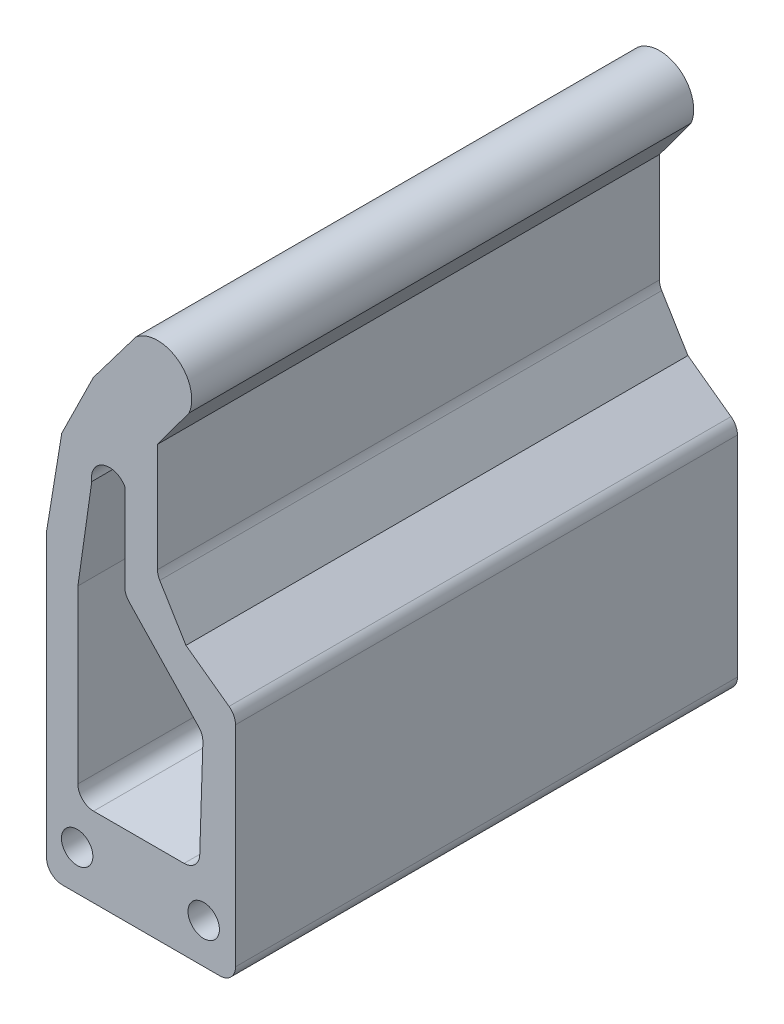
ISO-10303-21;
HEADER;
FILE_DESCRIPTION(('STEP AP214'),'2;1');
FILE_NAME('part.step','',(''),(''),'','','');
FILE_SCHEMA(('AUTOMOTIVE_DESIGN { 1 0 10303 214 1 1 1 1 }'));
ENDSEC;
DATA;
#1=APPLICATION_CONTEXT('core data for automotive mechanical design processes');
#2=APPLICATION_PROTOCOL_DEFINITION('international standard','automotive_design',2000,#1);
#3=PRODUCT_CONTEXT('',#1,'mechanical');
#4=PRODUCT('Part','Part','',(#3));
#5=PRODUCT_RELATED_PRODUCT_CATEGORY('part','',(#4));
#6=PRODUCT_DEFINITION_FORMATION('','',#4);
#7=PRODUCT_DEFINITION_CONTEXT('part definition',#1,'design');
#8=PRODUCT_DEFINITION('design','',#6,#7);
#9=PRODUCT_DEFINITION_SHAPE('','',#8);
#10=(LENGTH_UNIT() NAMED_UNIT(*) SI_UNIT(.MILLI.,.METRE.));
#11=(NAMED_UNIT(*) PLANE_ANGLE_UNIT() SI_UNIT($,.RADIAN.));
#12=(NAMED_UNIT(*) SI_UNIT($,.STERADIAN.) SOLID_ANGLE_UNIT());
#13=UNCERTAINTY_MEASURE_WITH_UNIT(LENGTH_MEASURE(1.E-05),#10,'distance_accuracy_value','');
#14=(GEOMETRIC_REPRESENTATION_CONTEXT(3) GLOBAL_UNCERTAINTY_ASSIGNED_CONTEXT((#13)) GLOBAL_UNIT_ASSIGNED_CONTEXT((#10,
#11,#12)) REPRESENTATION_CONTEXT('',''));
#15=CARTESIAN_POINT('',(0.,0.,0.));
#16=DIRECTION('',(0.,0.,1.));
#17=DIRECTION('',(1.,0.,0.));
#18=AXIS2_PLACEMENT_3D('',#15,#16,#17);
#19=CARTESIAN_POINT('',(-300.,367.,72.));
#20=DIRECTION('',(0.986834646515188,-0.161732434710062,0.));
#21=DIRECTION('',(0.161732434710062,0.986834646515188,0.));
#22=AXIS2_PLACEMENT_3D('',#19,#20,#21);
#23=PLANE('',#22);
#24=DIRECTION('',(-0.161732434710062,-0.986834646515188,0.));
#25=VECTOR('',#24,1.);
#26=CARTESIAN_POINT('',(-300.,367.,40.));
#27=LINE('',#26,#25);
#28=CARTESIAN_POINT('',(-299.02960539174,372.921007879091,40.));
#29=VERTEX_POINT('',#28);
#30=CARTESIAN_POINT('',(-300.,367.,40.));
#31=VERTEX_POINT('',#30);
#32=EDGE_CURVE('E292',#29,#31,#27,.T.);
#33=ORIENTED_EDGE('',*,*,#32,.T.);
#34=DIRECTION('',(0.,0.,-1.));
#35=VECTOR('',#34,1.);
#36=CARTESIAN_POINT('',(-300.,367.,72.));
#37=LINE('',#36,#35);
#38=CARTESIAN_POINT('',(-300.,367.,72.));
#39=VERTEX_POINT('',#38);
#40=EDGE_CURVE('E391',#39,#31,#37,.T.);
#41=ORIENTED_EDGE('',*,*,#40,.F.);
#42=DIRECTION('',(-0.161732434710062,-0.986834646515188,0.));
#43=VECTOR('',#42,1.);
#44=CARTESIAN_POINT('',(-300.,367.,72.));
#45=LINE('',#44,#43);
#46=CARTESIAN_POINT('',(-299.02960539174,372.921007879091,72.));
#47=VERTEX_POINT('',#46);
#48=EDGE_CURVE('E295',#47,#39,#45,.T.);
#49=ORIENTED_EDGE('',*,*,#48,.F.);
#50=DIRECTION('',(0.,0.,-1.));
#51=VECTOR('',#50,1.);
#52=CARTESIAN_POINT('',(-299.02960539174,372.921007879091,72.));
#53=LINE('',#52,#51);
#54=EDGE_CURVE('E332',#47,#29,#53,.T.);
#55=ORIENTED_EDGE('',*,*,#54,.T.);
#56=EDGE_LOOP('',(#33,#41,#49,#55));
#57=FACE_BOUND('',#56,.T.);
#58=ADVANCED_FACE('F39',(#57),#23,.F.);
#59=CARTESIAN_POINT('',(-300.,367.,72.));
#60=DIRECTION('',(1.,0.,0.));
#61=DIRECTION('',(0.,0.,-1.));
#62=AXIS2_PLACEMENT_3D('',#59,#60,#61);
#63=PLANE('',#62);
#64=DIRECTION('',(0.,-1.,0.));
#65=VECTOR('',#64,1.);
#66=CARTESIAN_POINT('',(-300.,367.,40.));
#67=LINE('',#66,#65);
#68=CARTESIAN_POINT('',(-300.,349.,40.));
#69=VERTEX_POINT('',#68);
#70=EDGE_CURVE('E336',#31,#69,#67,.T.);
#71=ORIENTED_EDGE('',*,*,#70,.T.);
#72=DIRECTION('',(0.,0.,-1.));
#73=VECTOR('',#72,1.);
#74=CARTESIAN_POINT('',(-300.,349.,72.));
#75=LINE('',#74,#73);
#76=CARTESIAN_POINT('',(-300.,349.,72.));
#77=VERTEX_POINT('',#76);
#78=EDGE_CURVE('E442',#69,#77,#75,.F.);
#79=ORIENTED_EDGE('',*,*,#78,.T.);
#80=DIRECTION('',(0.,-1.,0.));
#81=VECTOR('',#80,1.);
#82=CARTESIAN_POINT('',(-300.,367.,72.));
#83=LINE('',#82,#81);
#84=EDGE_CURVE('E299',#39,#77,#83,.T.);
#85=ORIENTED_EDGE('',*,*,#84,.F.);
#86=ORIENTED_EDGE('',*,*,#40,.T.);
#87=EDGE_LOOP('',(#71,#79,#85,#86));
#88=FACE_BOUND('',#87,.T.);
#89=ADVANCED_FACE('F540',(#88),#63,.F.);
#90=CARTESIAN_POINT('',(-300.,348.,72.));
#91=DIRECTION('',(0.,1.,0.));
#92=DIRECTION('',(0.,0.,1.));
#93=AXIS2_PLACEMENT_3D('',#90,#91,#92);
#94=PLANE('',#93);
#95=DIRECTION('',(1.,0.,0.));
#96=VECTOR('',#95,1.);
#97=CARTESIAN_POINT('',(-300.,348.,40.));
#98=LINE('',#97,#96);
#99=CARTESIAN_POINT('',(-299.,348.,40.));
#100=VERTEX_POINT('',#99);
#101=CARTESIAN_POINT('',(-288.951606439745,348.,40.));
#102=VERTEX_POINT('',#101);
#103=EDGE_CURVE('E340',#100,#102,#98,.T.);
#104=ORIENTED_EDGE('',*,*,#103,.T.);
#105=DIRECTION('',(0.,0.,-1.));
#106=VECTOR('',#105,1.);
#107=CARTESIAN_POINT('',(-288.951606439745,348.,72.));
#108=LINE('',#107,#106);
#109=CARTESIAN_POINT('',(-288.951606439745,348.,72.));
#110=VERTEX_POINT('',#109);
#111=EDGE_CURVE('E55',#102,#110,#108,.F.);
#112=ORIENTED_EDGE('',*,*,#111,.T.);
#113=DIRECTION('',(1.,0.,0.));
#114=VECTOR('',#113,1.);
#115=CARTESIAN_POINT('',(-300.,348.,72.));
#116=LINE('',#115,#114);
#117=CARTESIAN_POINT('',(-299.,348.,72.));
#118=VERTEX_POINT('',#117);
#119=EDGE_CURVE('E303',#118,#110,#116,.T.);
#120=ORIENTED_EDGE('',*,*,#119,.F.);
#121=DIRECTION('',(0.,0.,-1.));
#122=VECTOR('',#121,1.);
#123=CARTESIAN_POINT('',(-299.,348.,72.));
#124=LINE('',#123,#122);
#125=EDGE_CURVE('E436',#118,#100,#124,.T.);
#126=ORIENTED_EDGE('',*,*,#125,.T.);
#127=EDGE_LOOP('',(#104,#112,#120,#126));
#128=FACE_BOUND('',#127,.T.);
#129=ADVANCED_FACE('F546',(#128),#94,.F.);
#130=CARTESIAN_POINT('',(-287.951606439745,348.,72.));
#131=DIRECTION('',(-1.,0.,0.));
#132=DIRECTION('',(0.,0.,1.));
#133=AXIS2_PLACEMENT_3D('',#130,#131,#132);
#134=PLANE('',#133);
#135=DIRECTION('',(0.,1.,0.));
#136=VECTOR('',#135,1.);
#137=CARTESIAN_POINT('',(-287.951606439745,348.,40.));
#138=LINE('',#137,#136);
#139=CARTESIAN_POINT('',(-287.951606439745,349.,40.));
#140=VERTEX_POINT('',#139);
#141=CARTESIAN_POINT('',(-287.951606439745,362.362205386471,40.));
#142=VERTEX_POINT('',#141);
#143=EDGE_CURVE('E343',#140,#142,#138,.T.);
#144=ORIENTED_EDGE('',*,*,#143,.T.);
#145=DIRECTION('',(0.,0.,-1.));
#146=VECTOR('',#145,1.);
#147=CARTESIAN_POINT('',(-287.951606439745,362.362205386471,72.));
#148=LINE('',#147,#146);
#149=CARTESIAN_POINT('',(-287.951606439745,362.362205386471,72.));
#150=VERTEX_POINT('',#149);
#151=EDGE_CURVE('E422',#142,#150,#148,.F.);
#152=ORIENTED_EDGE('',*,*,#151,.T.);
#153=DIRECTION('',(0.,1.,0.));
#154=VECTOR('',#153,1.);
#155=CARTESIAN_POINT('',(-287.951606439745,348.,72.));
#156=LINE('',#155,#154);
#157=CARTESIAN_POINT('',(-287.951606439745,349.,72.));
#158=VERTEX_POINT('',#157);
#159=EDGE_CURVE('E306',#158,#150,#156,.T.);
#160=ORIENTED_EDGE('',*,*,#159,.F.);
#161=DIRECTION('',(0.,0.,-1.));
#162=VECTOR('',#161,1.);
#163=CARTESIAN_POINT('',(-287.951606439745,349.,72.));
#164=LINE('',#163,#162);
#165=EDGE_CURVE('E418',#158,#140,#164,.T.);
#166=ORIENTED_EDGE('',*,*,#165,.T.);
#167=EDGE_LOOP('',(#144,#152,#160,#166));
#168=FACE_BOUND('',#167,.T.);
#169=ADVANCED_FACE('F710',(#168),#134,.F.);
#170=CARTESIAN_POINT('',(-287.951606439745,362.871836257271,72.));
#171=DIRECTION('',(-0.587649831397212,-0.809115366099809,0.));
#172=DIRECTION('',(0.809115366099809,-0.587649831397212,0.));
#173=AXIS2_PLACEMENT_3D('',#170,#171,#172);
#174=PLANE('',#173);
#175=DIRECTION('',(-0.809115366099809,0.587649831397212,0.));
#176=VECTOR('',#175,1.);
#177=CARTESIAN_POINT('',(-287.951606439745,362.871836257271,72.));
#178=LINE('',#177,#176);
#179=CARTESIAN_POINT('',(-288.363956608348,363.171320752571,72.));
#180=VERTEX_POINT('',#179);
#181=CARTESIAN_POINT('',(-291.110931396484,365.166412353516,72.));
#182=VERTEX_POINT('',#181);
#183=EDGE_CURVE('E310',#180,#182,#178,.T.);
#184=ORIENTED_EDGE('',*,*,#183,.F.);
#185=DIRECTION('',(0.,0.,-1.));
#186=VECTOR('',#185,1.);
#187=CARTESIAN_POINT('',(-288.363956608348,363.171320752571,72.));
#188=LINE('',#187,#186);
#189=CARTESIAN_POINT('',(-288.363956608348,363.171320752571,40.));
#190=VERTEX_POINT('',#189);
#191=EDGE_CURVE('E402',#180,#190,#188,.T.);
#192=ORIENTED_EDGE('',*,*,#191,.T.);
#193=DIRECTION('',(-0.809115366099809,0.587649831397212,0.));
#194=VECTOR('',#193,1.);
#195=CARTESIAN_POINT('',(-287.951606439745,362.871836257271,40.));
#196=LINE('',#195,#194);
#197=CARTESIAN_POINT('',(-291.110931396484,365.166412353516,40.));
#198=VERTEX_POINT('',#197);
#199=EDGE_CURVE('E347',#190,#198,#196,.T.);
#200=ORIENTED_EDGE('',*,*,#199,.T.);
#201=DIRECTION('',(0.,0.,-1.));
#202=VECTOR('',#201,1.);
#203=CARTESIAN_POINT('',(-291.110931396484,365.166412353516,72.));
#204=LINE('',#203,#202);
#205=EDGE_CURVE('E387',#182,#198,#204,.T.);
#206=ORIENTED_EDGE('',*,*,#205,.F.);
#207=EDGE_LOOP('',(#184,#192,#200,#206));
#208=FACE_BOUND('',#207,.T.);
#209=ADVANCED_FACE('F700',(#208),#174,.F.);
#210=CARTESIAN_POINT('',(-291.110931396484,365.166412353516,72.));
#211=DIRECTION('',(-0.855055239305162,-0.518536920321776,0.));
#212=DIRECTION('',(0.518536920321776,-0.855055239305162,0.));
#213=AXIS2_PLACEMENT_3D('',#210,#211,#212);
#214=PLANE('',#213);
#215=DIRECTION('',(-0.518536920321776,0.855055239305162,0.));
#216=VECTOR('',#215,1.);
#217=CARTESIAN_POINT('',(-291.110931396484,365.166412353516,40.));
#218=LINE('',#217,#216);
#219=CARTESIAN_POINT('',(-292.780865856916,367.920095174793,40.));
#220=VERTEX_POINT('',#219);
#221=EDGE_CURVE('E350',#198,#220,#218,.T.);
#222=ORIENTED_EDGE('',*,*,#221,.T.);
#223=DIRECTION('',(0.,0.,-1.));
#224=VECTOR('',#223,1.);
#225=CARTESIAN_POINT('',(-292.780865856916,367.920095174793,72.));
#226=LINE('',#225,#224);
#227=CARTESIAN_POINT('',(-292.780865856916,367.920095174793,72.));
#228=VERTEX_POINT('',#227);
#229=EDGE_CURVE('E399',#220,#228,#226,.F.);
#230=ORIENTED_EDGE('',*,*,#229,.T.);
#231=DIRECTION('',(-0.518536920321776,0.855055239305162,0.));
#232=VECTOR('',#231,1.);
#233=CARTESIAN_POINT('',(-291.110931396484,365.166412353516,72.));
#234=LINE('',#233,#232);
#235=EDGE_CURVE('E313',#182,#228,#234,.T.);
#236=ORIENTED_EDGE('',*,*,#235,.F.);
#237=ORIENTED_EDGE('',*,*,#205,.T.);
#238=EDGE_LOOP('',(#222,#230,#236,#237));
#239=FACE_BOUND('',#238,.T.);
#240=ADVANCED_FACE('F688',(#239),#214,.F.);
#241=CARTESIAN_POINT('',(-292.925810617611,368.159105691084,72.));
#242=DIRECTION('',(-1.,0.,0.));
#243=DIRECTION('',(0.,0.,1.));
#244=AXIS2_PLACEMENT_3D('',#241,#242,#243);
#245=PLANE('',#244);
#246=DIRECTION('',(0.,1.,0.));
#247=VECTOR('',#246,1.);
#248=CARTESIAN_POINT('',(-292.925810617611,368.159105691084,72.));
#249=LINE('',#248,#247);
#250=CARTESIAN_POINT('',(-292.925810617611,368.438632095115,72.));
#251=VERTEX_POINT('',#250);
#252=CARTESIAN_POINT('',(-292.925810617611,375.359105691084,72.));
#253=VERTEX_POINT('',#252);
#254=EDGE_CURVE('E317',#251,#253,#249,.T.);
#255=ORIENTED_EDGE('',*,*,#254,.F.);
#256=DIRECTION('',(0.,0.,-1.));
#257=VECTOR('',#256,1.);
#258=CARTESIAN_POINT('',(-292.925810617611,368.438632095115,40.));
#259=LINE('',#258,#257);
#260=CARTESIAN_POINT('',(-292.925810617611,368.438632095115,40.));
#261=VERTEX_POINT('',#260);
#262=EDGE_CURVE('E395',#251,#261,#259,.T.);
#263=ORIENTED_EDGE('',*,*,#262,.T.);
#264=DIRECTION('',(0.,1.,0.));
#265=VECTOR('',#264,1.);
#266=CARTESIAN_POINT('',(-292.925810617611,368.159105691084,40.));
#267=LINE('',#266,#265);
#268=CARTESIAN_POINT('',(-292.925810617611,375.359105691084,40.));
#269=VERTEX_POINT('',#268);
#270=EDGE_CURVE('E354',#261,#269,#267,.T.);
#271=ORIENTED_EDGE('',*,*,#270,.T.);
#272=DIRECTION('',(0.,0.,-1.));
#273=VECTOR('',#272,1.);
#274=CARTESIAN_POINT('',(-292.925810617611,375.359105691084,72.));
#275=LINE('',#274,#273);
#276=EDGE_CURVE('E383',#253,#269,#275,.T.);
#277=ORIENTED_EDGE('',*,*,#276,.F.);
#278=EDGE_LOOP('',(#255,#263,#271,#277));
#279=FACE_BOUND('',#278,.T.);
#280=ADVANCED_FACE('F682',(#279),#245,.F.);
#281=CARTESIAN_POINT('',(-292.925810617611,375.359105691084,72.));
#282=DIRECTION('',(-0.805397111157276,0.592735601545507,0.));
#283=DIRECTION('',(-0.592735601545507,-0.805397111157276,0.));
#284=AXIS2_PLACEMENT_3D('',#281,#282,#283);
#285=PLANE('',#284);
#286=DIRECTION('',(0.592735601545507,0.805397111157276,0.));
#287=VECTOR('',#286,1.);
#288=CARTESIAN_POINT('',(-292.925810617611,375.359105691084,40.));
#289=LINE('',#288,#287);
#290=CARTESIAN_POINT('',(-290.910509572356,378.097455869018,40.));
#291=VERTEX_POINT('',#290);
#292=EDGE_CURVE('E357',#269,#291,#289,.T.);
#293=ORIENTED_EDGE('',*,*,#292,.T.);
#294=DIRECTION('',(0.,0.,-1.));
#295=VECTOR('',#294,1.);
#296=CARTESIAN_POINT('',(-290.910509572356,378.097455869018,72.));
#297=LINE('',#296,#295);
#298=CARTESIAN_POINT('',(-290.910509572356,378.097455869018,72.));
#299=VERTEX_POINT('',#298);
#300=EDGE_CURVE('E379',#299,#291,#297,.T.);
#301=ORIENTED_EDGE('',*,*,#300,.F.);
#302=DIRECTION('',(0.592735601545507,0.805397111157276,0.));
#303=VECTOR('',#302,1.);
#304=CARTESIAN_POINT('',(-292.925810617611,375.359105691084,72.));
#305=LINE('',#304,#303);
#306=EDGE_CURVE('E320',#253,#299,#305,.T.);
#307=ORIENTED_EDGE('',*,*,#306,.F.);
#308=ORIENTED_EDGE('',*,*,#276,.T.);
#309=EDGE_LOOP('',(#293,#301,#307,#308));
#310=FACE_BOUND('',#309,.T.);
#311=ADVANCED_FACE('F687',(#310),#285,.F.);
#312=CARTESIAN_POINT('',(-292.914695624546,378.929613057887,72.));
#313=DIRECTION('',(0.,0.,-1.));
#314=DIRECTION('',(-1.,0.,0.));
#315=AXIS2_PLACEMENT_3D('',#312,#313,#314);
#316=CYLINDRICAL_SURFACE('',#315,2.17008002589271);
#317=CARTESIAN_POINT('',(-292.914695624546,378.929613057887,40.));
#318=DIRECTION('',(0.,0.,1.));
#319=DIRECTION('',(-1.,0.,0.));
#320=AXIS2_PLACEMENT_3D('',#317,#318,#319);
#321=CIRCLE('',#320,2.17008002589271);
#322=CARTESIAN_POINT('',(-294.299987792969,380.600006103516,40.));
#323=VERTEX_POINT('',#322);
#324=EDGE_CURVE('E360',#291,#323,#321,.T.);
#325=ORIENTED_EDGE('',*,*,#324,.T.);
#326=DIRECTION('',(0.,0.,-1.));
#327=VECTOR('',#326,1.);
#328=CARTESIAN_POINT('',(-294.299987792969,380.600006103516,72.));
#329=LINE('',#328,#327);
#330=CARTESIAN_POINT('',(-294.299987792969,380.600006103516,72.));
#331=VERTEX_POINT('',#330);
#332=EDGE_CURVE('E375',#331,#323,#329,.T.);
#333=ORIENTED_EDGE('',*,*,#332,.F.);
#334=CARTESIAN_POINT('',(-292.914695624546,378.929613057887,72.));
#335=DIRECTION('',(0.,0.,1.));
#336=DIRECTION('',(-1.,0.,0.));
#337=AXIS2_PLACEMENT_3D('',#334,#335,#336);
#338=CIRCLE('',#337,2.17008002589271);
#339=EDGE_CURVE('E323',#299,#331,#338,.T.);
#340=ORIENTED_EDGE('',*,*,#339,.F.);
#341=ORIENTED_EDGE('',*,*,#300,.T.);
#342=EDGE_LOOP('',(#325,#333,#340,#341));
#343=FACE_BOUND('',#342,.T.);
#344=ADVANCED_FACE('F778',(#343),#316,.T.);
#345=CARTESIAN_POINT('',(-297.012375964007,377.009330622549,72.));
#346=DIRECTION('',(0.797927884659181,-0.602752926897352,0.));
#347=DIRECTION('',(0.602752926897352,0.797927884659181,0.));
#348=AXIS2_PLACEMENT_3D('',#345,#346,#347);
#349=PLANE('',#348);
#350=DIRECTION('',(-0.602752926897352,-0.797927884659181,0.));
#351=VECTOR('',#350,1.);
#352=CARTESIAN_POINT('',(-297.012375964007,377.009330622549,40.));
#353=LINE('',#352,#351);
#354=CARTESIAN_POINT('',(-297.012375964007,377.009330622549,40.));
#355=VERTEX_POINT('',#354);
#356=EDGE_CURVE('E363',#323,#355,#353,.T.);
#357=ORIENTED_EDGE('',*,*,#356,.T.);
#358=DIRECTION('',(0.,0.,-1.));
#359=VECTOR('',#358,1.);
#360=CARTESIAN_POINT('',(-297.012375964007,377.009330622549,72.));
#361=LINE('',#360,#359);
#362=CARTESIAN_POINT('',(-297.012375964007,377.009330622549,72.));
#363=VERTEX_POINT('',#362);
#364=EDGE_CURVE('E371',#363,#355,#361,.T.);
#365=ORIENTED_EDGE('',*,*,#364,.F.);
#366=DIRECTION('',(-0.602752926897352,-0.797927884659181,0.));
#367=VECTOR('',#366,1.);
#368=CARTESIAN_POINT('',(-297.012375964007,377.009330622549,72.));
#369=LINE('',#368,#367);
#370=EDGE_CURVE('E326',#331,#363,#369,.T.);
#371=ORIENTED_EDGE('',*,*,#370,.F.);
#372=ORIENTED_EDGE('',*,*,#332,.T.);
#373=EDGE_LOOP('',(#357,#365,#371,#372));
#374=FACE_BOUND('',#373,.T.);
#375=ADVANCED_FACE('F768',(#374),#349,.F.);
#376=CARTESIAN_POINT('',(-299.02960539174,372.921007879091,72.));
#377=DIRECTION('',(0.896777724669226,-0.442481313206655,0.));
#378=DIRECTION('',(0.442481313206655,0.896777724669226,0.));
#379=AXIS2_PLACEMENT_3D('',#376,#377,#378);
#380=PLANE('',#379);
#381=DIRECTION('',(-0.442481313206655,-0.896777724669226,0.));
#382=VECTOR('',#381,1.);
#383=CARTESIAN_POINT('',(-299.02960539174,372.921007879091,40.));
#384=LINE('',#383,#382);
#385=EDGE_CURVE('E300',#355,#29,#384,.T.);
#386=ORIENTED_EDGE('',*,*,#385,.T.);
#387=ORIENTED_EDGE('',*,*,#54,.F.);
#388=DIRECTION('',(-0.442481313206655,-0.896777724669226,0.));
#389=VECTOR('',#388,1.);
#390=CARTESIAN_POINT('',(-299.02960539174,372.921007879091,72.));
#391=LINE('',#390,#389);
#392=EDGE_CURVE('E329',#363,#47,#391,.T.);
#393=ORIENTED_EDGE('',*,*,#392,.F.);
#394=ORIENTED_EDGE('',*,*,#364,.T.);
#395=EDGE_LOOP('',(#386,#387,#393,#394));
#396=FACE_BOUND('',#395,.T.);
#397=ADVANCED_FACE('F674',(#396),#380,.F.);
#398=CARTESIAN_POINT('',(-292.914695624546,378.929613057887,72.));
#399=DIRECTION('',(0.,0.,-1.));
#400=DIRECTION('',(-1.,0.,0.));
#401=AXIS2_PLACEMENT_3D('',#398,#399,#400);
#402=PLANE('',#401);
#403=CARTESIAN_POINT('',(-298.046417961778,350.54605621625,72.));
#404=DIRECTION('',(0.,0.,1.));
#405=DIRECTION('',(1.,0.,0.));
#406=AXIS2_PLACEMENT_3D('',#403,#404,#405);
#407=CIRCLE('',#406,0.999999999999998);
#408=CARTESIAN_POINT('',(-297.046417961778,350.54605621625,72.));
#409=VERTEX_POINT('',#408);
#410=EDGE_CURVE('E847',#409,#409,#407,.T.);
#411=ORIENTED_EDGE('',*,*,#410,.F.);
#412=EDGE_LOOP('',(#411));
#413=FACE_BOUND('',#412,.T.);
#414=CARTESIAN_POINT('',(-289.979523898029,350.54605621625,72.));
#415=DIRECTION('',(0.,0.,1.));
#416=DIRECTION('',(1.,0.,0.));
#417=AXIS2_PLACEMENT_3D('',#414,#415,#416);
#418=CIRCLE('',#417,0.999999999999998);
#419=CARTESIAN_POINT('',(-288.979523898029,350.54605621625,72.));
#420=VERTEX_POINT('',#419);
#421=EDGE_CURVE('E250',#420,#420,#418,.T.);
#422=ORIENTED_EDGE('',*,*,#421,.F.);
#423=EDGE_LOOP('',(#422));
#424=FACE_BOUND('',#423,.T.);
#425=DIRECTION('',(0.,1.,0.));
#426=VECTOR('',#425,1.);
#427=CARTESIAN_POINT('',(-295.010009765625,366.046598155361,72.));
#428=LINE('',#427,#426);
#429=CARTESIAN_POINT('',(-295.010009765625,366.445117957466,72.));
#430=VERTEX_POINT('',#429);
#431=CARTESIAN_POINT('',(-295.010009765625,371.995180702691,72.));
#432=VERTEX_POINT('',#431);
#433=EDGE_CURVE('E244',#430,#432,#428,.T.);
#434=ORIENTED_EDGE('',*,*,#433,.F.);
#435=CARTESIAN_POINT('',(-294.010009765625,366.445117957466,72.));
#436=DIRECTION('',(0.,0.,-1.));
#437=DIRECTION('',(-1.,0.,0.));
#438=AXIS2_PLACEMENT_3D('',#435,#436,#437);
#439=CIRCLE('',#438,1.);
#440=CARTESIAN_POINT('',(-294.735906277084,365.757314021266,72.));
#441=VERTEX_POINT('',#440);
#442=EDGE_CURVE('E425',#430,#441,#439,.F.);
#443=ORIENTED_EDGE('',*,*,#442,.T.);
#444=DIRECTION('',(-0.687803936199452,0.725896511459134,0.));
#445=VECTOR('',#444,1.);
#446=CARTESIAN_POINT('',(-290.018829345703,360.778991699219,72.));
#447=LINE('',#446,#445);
#448=CARTESIAN_POINT('',(-290.305656331398,361.081703994614,72.));
#449=VERTEX_POINT('',#448);
#450=EDGE_CURVE('E247',#449,#441,#447,.T.);
#451=ORIENTED_EDGE('',*,*,#450,.F.);
#452=CARTESIAN_POINT('',(-291.031552842858,360.393900058414,72.));
#453=DIRECTION('',(0.,0.,-1.));
#454=DIRECTION('',(-1.,0.,0.));
#455=AXIS2_PLACEMENT_3D('',#452,#453,#454);
#456=CIRCLE('',#455,1.);
#457=CARTESIAN_POINT('',(-290.032055956022,360.362182977758,72.));
#458=VERTEX_POINT('',#457);
#459=EDGE_CURVE('E479',#449,#458,#456,.T.);
#460=ORIENTED_EDGE('',*,*,#459,.T.);
#461=DIRECTION('',(0.0317170806563282,0.999496886835892,0.));
#462=VECTOR('',#461,1.);
#463=CARTESIAN_POINT('',(-290.263445910318,353.07041670614,72.));
#464=LINE('',#463,#462);
#465=CARTESIAN_POINT('',(-290.232719343927,354.038699625483,72.));
#466=VERTEX_POINT('',#465);
#467=EDGE_CURVE('E282',#466,#458,#464,.T.);
#468=ORIENTED_EDGE('',*,*,#467,.F.);
#469=CARTESIAN_POINT('',(-291.232216230763,354.07041670614,72.));
#470=DIRECTION('',(0.,0.,-1.));
#471=DIRECTION('',(-1.,0.,0.));
#472=AXIS2_PLACEMENT_3D('',#469,#470,#471);
#473=CIRCLE('',#472,1.);
#474=CARTESIAN_POINT('',(-291.232216230763,353.07041670614,72.));
#475=VERTEX_POINT('',#474);
#476=EDGE_CURVE('E485',#466,#475,#473,.T.);
#477=ORIENTED_EDGE('',*,*,#476,.T.);
#478=DIRECTION('',(1.,0.,0.));
#479=VECTOR('',#478,1.);
#480=CARTESIAN_POINT('',(-298.,353.07041670614,72.));
#481=LINE('',#480,#479);
#482=CARTESIAN_POINT('',(-297.,353.07041670614,72.));
#483=VERTEX_POINT('',#482);
#484=EDGE_CURVE('E278',#483,#475,#481,.T.);
#485=ORIENTED_EDGE('',*,*,#484,.F.);
#486=CARTESIAN_POINT('',(-297.,354.07041670614,72.));
#487=DIRECTION('',(0.,0.,-1.));
#488=DIRECTION('',(-1.,0.,0.));
#489=AXIS2_PLACEMENT_3D('',#486,#487,#488);
#490=CIRCLE('',#489,1.);
#491=CARTESIAN_POINT('',(-298.,354.07041670614,72.));
#492=VERTEX_POINT('',#491);
#493=EDGE_CURVE('E48',#483,#492,#490,.T.);
#494=ORIENTED_EDGE('',*,*,#493,.T.);
#495=DIRECTION('',(0.,-1.,0.));
#496=VECTOR('',#495,1.);
#497=CARTESIAN_POINT('',(-298.,365.,72.));
#498=LINE('',#497,#496);
#499=CARTESIAN_POINT('',(-298.,365.,72.));
#500=VERTEX_POINT('',#499);
#501=EDGE_CURVE('E274',#500,#492,#498,.T.);
#502=ORIENTED_EDGE('',*,*,#501,.F.);
#503=DIRECTION('',(-0.140886164265566,-0.990025802046864,0.));
#504=VECTOR('',#503,1.);
#505=CARTESIAN_POINT('',(-297.116612997975,371.207677877785,72.));
#506=LINE('',#505,#504);
#507=CARTESIAN_POINT('',(-297.116612997975,371.207677877785,72.));
#508=VERTEX_POINT('',#507);
#509=EDGE_CURVE('E270',#508,#500,#506,.T.);
#510=ORIENTED_EDGE('',*,*,#509,.F.);
#511=CARTESIAN_POINT('',(-295.991386116136,371.409026174535,72.));
#512=DIRECTION('',(0.,0.,1.));
#513=DIRECTION('',(-1.,0.,0.));
#514=AXIS2_PLACEMENT_3D('',#511,#512,#513);
#515=CIRCLE('',#514,1.14309958980794);
#516=EDGE_CURVE('E221',#432,#508,#515,.T.);
#517=ORIENTED_EDGE('',*,*,#516,.F.);
#518=EDGE_LOOP('',(#434,#443,#451,#460,#468,#477,#485,#494,#502,#510,#517));
#519=FACE_BOUND('',#518,.T.);
#520=ORIENTED_EDGE('',*,*,#159,.T.);
#521=CARTESIAN_POINT('',(-288.951606439745,362.362205386471,72.));
#522=DIRECTION('',(0.,0.,-1.));
#523=DIRECTION('',(-1.,0.,0.));
#524=AXIS2_PLACEMENT_3D('',#521,#522,#523);
#525=CIRCLE('',#524,1.);
#526=EDGE_CURVE('E433',#150,#180,#525,.F.);
#527=ORIENTED_EDGE('',*,*,#526,.T.);
#528=ORIENTED_EDGE('',*,*,#183,.T.);
#529=ORIENTED_EDGE('',*,*,#235,.T.);
#530=CARTESIAN_POINT('',(-291.925810617611,368.438632095115,72.));
#531=DIRECTION('',(0.,0.,-1.));
#532=DIRECTION('',(-1.,0.,0.));
#533=AXIS2_PLACEMENT_3D('',#530,#531,#532);
#534=CIRCLE('',#533,1.);
#535=EDGE_CURVE('E476',#228,#251,#534,.T.);
#536=ORIENTED_EDGE('',*,*,#535,.T.);
#537=ORIENTED_EDGE('',*,*,#254,.T.);
#538=ORIENTED_EDGE('',*,*,#306,.T.);
#539=ORIENTED_EDGE('',*,*,#339,.T.);
#540=ORIENTED_EDGE('',*,*,#370,.T.);
#541=ORIENTED_EDGE('',*,*,#392,.T.);
#542=ORIENTED_EDGE('',*,*,#48,.T.);
#543=ORIENTED_EDGE('',*,*,#84,.T.);
#544=CARTESIAN_POINT('',(-299.,349.,72.));
#545=DIRECTION('',(0.,0.,-1.));
#546=DIRECTION('',(-1.,0.,0.));
#547=AXIS2_PLACEMENT_3D('',#544,#545,#546);
#548=CIRCLE('',#547,1.);
#549=EDGE_CURVE('E62',#77,#118,#548,.F.);
#550=ORIENTED_EDGE('',*,*,#549,.T.);
#551=ORIENTED_EDGE('',*,*,#119,.T.);
#552=CARTESIAN_POINT('',(-288.951606439745,349.,72.));
#553=DIRECTION('',(0.,0.,-1.));
#554=DIRECTION('',(-1.,0.,0.));
#555=AXIS2_PLACEMENT_3D('',#552,#553,#554);
#556=CIRCLE('',#555,1.);
#557=EDGE_CURVE('E430',#110,#158,#556,.F.);
#558=ORIENTED_EDGE('',*,*,#557,.T.);
#559=EDGE_LOOP('',(#520,#527,#528,#529,#536,#537,#538,#539,#540,#541,#542,#543,#550,#551,#558));
#560=FACE_BOUND('',#559,.T.);
#561=ADVANCED_FACE('F495',(#413,#424,#519,#560),#402,.F.);
#562=CARTESIAN_POINT('',(-292.914695624546,378.929613057887,40.));
#563=DIRECTION('',(0.,0.,-1.));
#564=DIRECTION('',(-1.,0.,0.));
#565=AXIS2_PLACEMENT_3D('',#562,#563,#564);
#566=PLANE('',#565);
#567=CARTESIAN_POINT('',(-298.046417961778,350.54605621625,40.));
#568=DIRECTION('',(0.,0.,1.));
#569=DIRECTION('',(1.,0.,0.));
#570=AXIS2_PLACEMENT_3D('',#567,#568,#569);
#571=CIRCLE('',#570,0.999999999999998);
#572=CARTESIAN_POINT('',(-297.046417961778,350.54605621625,40.));
#573=VERTEX_POINT('',#572);
#574=EDGE_CURVE('E271',#573,#573,#571,.T.);
#575=ORIENTED_EDGE('',*,*,#574,.T.);
#576=EDGE_LOOP('',(#575));
#577=FACE_BOUND('',#576,.T.);
#578=CARTESIAN_POINT('',(-289.979523898029,350.54605621625,40.));
#579=DIRECTION('',(0.,0.,1.));
#580=DIRECTION('',(1.,0.,0.));
#581=AXIS2_PLACEMENT_3D('',#578,#579,#580);
#582=CIRCLE('',#581,0.999999999999998);
#583=CARTESIAN_POINT('',(-288.979523898029,350.54605621625,40.));
#584=VERTEX_POINT('',#583);
#585=EDGE_CURVE('E841',#584,#584,#582,.T.);
#586=ORIENTED_EDGE('',*,*,#585,.T.);
#587=EDGE_LOOP('',(#586));
#588=FACE_BOUND('',#587,.T.);
#589=DIRECTION('',(-0.687803936199452,0.725896511459134,0.));
#590=VECTOR('',#589,1.);
#591=CARTESIAN_POINT('',(-290.018829345703,360.778991699219,40.));
#592=LINE('',#591,#590);
#593=CARTESIAN_POINT('',(-290.305656331398,361.081703994614,40.));
#594=VERTEX_POINT('',#593);
#595=CARTESIAN_POINT('',(-294.735906277084,365.757314021266,40.));
#596=VERTEX_POINT('',#595);
#597=EDGE_CURVE('E263',#594,#596,#592,.T.);
#598=ORIENTED_EDGE('',*,*,#597,.T.);
#599=CARTESIAN_POINT('',(-294.010009765625,366.445117957466,40.));
#600=DIRECTION('',(0.,0.,-1.));
#601=DIRECTION('',(-1.,0.,0.));
#602=AXIS2_PLACEMENT_3D('',#599,#600,#601);
#603=CIRCLE('',#602,1.);
#604=CARTESIAN_POINT('',(-295.010009765625,366.445117957466,40.));
#605=VERTEX_POINT('',#604);
#606=EDGE_CURVE('E406',#596,#605,#603,.T.);
#607=ORIENTED_EDGE('',*,*,#606,.T.);
#608=DIRECTION('',(0.,1.,0.));
#609=VECTOR('',#608,1.);
#610=CARTESIAN_POINT('',(-295.010009765625,366.046598155361,40.));
#611=LINE('',#610,#609);
#612=CARTESIAN_POINT('',(-295.010009765625,371.995180702691,40.));
#613=VERTEX_POINT('',#612);
#614=EDGE_CURVE('E227',#605,#613,#611,.T.);
#615=ORIENTED_EDGE('',*,*,#614,.T.);
#616=CARTESIAN_POINT('',(-295.991386116136,371.409026174535,40.));
#617=DIRECTION('',(0.,0.,1.));
#618=DIRECTION('',(-1.,0.,0.));
#619=AXIS2_PLACEMENT_3D('',#616,#617,#618);
#620=CIRCLE('',#619,1.14309958980794);
#621=CARTESIAN_POINT('',(-297.116612997975,371.207677877785,40.));
#622=VERTEX_POINT('',#621);
#623=EDGE_CURVE('E219',#613,#622,#620,.T.);
#624=ORIENTED_EDGE('',*,*,#623,.T.);
#625=DIRECTION('',(-0.140886164265566,-0.990025802046864,0.));
#626=VECTOR('',#625,1.);
#627=CARTESIAN_POINT('',(-297.116612997975,371.207677877785,40.));
#628=LINE('',#627,#626);
#629=CARTESIAN_POINT('',(-298.,365.,40.));
#630=VERTEX_POINT('',#629);
#631=EDGE_CURVE('E231',#622,#630,#628,.T.);
#632=ORIENTED_EDGE('',*,*,#631,.T.);
#633=DIRECTION('',(0.,-1.,0.));
#634=VECTOR('',#633,1.);
#635=CARTESIAN_POINT('',(-298.,365.,40.));
#636=LINE('',#635,#634);
#637=CARTESIAN_POINT('',(-298.,354.07041670614,40.));
#638=VERTEX_POINT('',#637);
#639=EDGE_CURVE('E236',#630,#638,#636,.T.);
#640=ORIENTED_EDGE('',*,*,#639,.T.);
#641=CARTESIAN_POINT('',(-297.,354.07041670614,40.));
#642=DIRECTION('',(0.,0.,-1.));
#643=DIRECTION('',(-1.,0.,0.));
#644=AXIS2_PLACEMENT_3D('',#641,#642,#643);
#645=CIRCLE('',#644,1.);
#646=CARTESIAN_POINT('',(-297.,353.07041670614,40.));
#647=VERTEX_POINT('',#646);
#648=EDGE_CURVE('E11',#638,#647,#645,.F.);
#649=ORIENTED_EDGE('',*,*,#648,.T.);
#650=DIRECTION('',(1.,0.,0.));
#651=VECTOR('',#650,1.);
#652=CARTESIAN_POINT('',(-298.,353.07041670614,40.));
#653=LINE('',#652,#651);
#654=CARTESIAN_POINT('',(-291.232216230763,353.07041670614,40.));
#655=VERTEX_POINT('',#654);
#656=EDGE_CURVE('E255',#647,#655,#653,.T.);
#657=ORIENTED_EDGE('',*,*,#656,.T.);
#658=CARTESIAN_POINT('',(-291.232216230763,354.07041670614,40.));
#659=DIRECTION('',(0.,0.,-1.));
#660=DIRECTION('',(-1.,0.,0.));
#661=AXIS2_PLACEMENT_3D('',#658,#659,#660);
#662=CIRCLE('',#661,1.);
#663=CARTESIAN_POINT('',(-290.232719343927,354.038699625483,40.));
#664=VERTEX_POINT('',#663);
#665=EDGE_CURVE('E488',#655,#664,#662,.F.);
#666=ORIENTED_EDGE('',*,*,#665,.T.);
#667=DIRECTION('',(0.0317170806563282,0.999496886835892,0.));
#668=VECTOR('',#667,1.);
#669=CARTESIAN_POINT('',(-290.263445910318,353.07041670614,40.));
#670=LINE('',#669,#668);
#671=CARTESIAN_POINT('',(-290.032055956022,360.362182977758,40.));
#672=VERTEX_POINT('',#671);
#673=EDGE_CURVE('E259',#664,#672,#670,.T.);
#674=ORIENTED_EDGE('',*,*,#673,.T.);
#675=CARTESIAN_POINT('',(-291.031552842858,360.393900058414,40.));
#676=DIRECTION('',(0.,0.,-1.));
#677=DIRECTION('',(-1.,0.,0.));
#678=AXIS2_PLACEMENT_3D('',#675,#676,#677);
#679=CIRCLE('',#678,1.);
#680=EDGE_CURVE('E482',#672,#594,#679,.F.);
#681=ORIENTED_EDGE('',*,*,#680,.T.);
#682=EDGE_LOOP('',(#598,#607,#615,#624,#632,#640,#649,#657,#666,#674,#681));
#683=FACE_BOUND('',#682,.T.);
#684=ORIENTED_EDGE('',*,*,#199,.F.);
#685=CARTESIAN_POINT('',(-288.951606439745,362.362205386471,40.));
#686=DIRECTION('',(0.,0.,-1.));
#687=DIRECTION('',(-1.,0.,0.));
#688=AXIS2_PLACEMENT_3D('',#685,#686,#687);
#689=CIRCLE('',#688,1.);
#690=EDGE_CURVE('E415',#190,#142,#689,.T.);
#691=ORIENTED_EDGE('',*,*,#690,.T.);
#692=ORIENTED_EDGE('',*,*,#143,.F.);
#693=CARTESIAN_POINT('',(-288.951606439745,349.,40.));
#694=DIRECTION('',(0.,0.,-1.));
#695=DIRECTION('',(-1.,0.,0.));
#696=AXIS2_PLACEMENT_3D('',#693,#694,#695);
#697=CIRCLE('',#696,1.);
#698=EDGE_CURVE('E412',#140,#102,#697,.T.);
#699=ORIENTED_EDGE('',*,*,#698,.T.);
#700=ORIENTED_EDGE('',*,*,#103,.F.);
#701=CARTESIAN_POINT('',(-299.,349.,40.));
#702=DIRECTION('',(0.,0.,-1.));
#703=DIRECTION('',(-1.,0.,0.));
#704=AXIS2_PLACEMENT_3D('',#701,#702,#703);
#705=CIRCLE('',#704,1.);
#706=EDGE_CURVE('E409',#100,#69,#705,.T.);
#707=ORIENTED_EDGE('',*,*,#706,.T.);
#708=ORIENTED_EDGE('',*,*,#70,.F.);
#709=ORIENTED_EDGE('',*,*,#32,.F.);
#710=ORIENTED_EDGE('',*,*,#385,.F.);
#711=ORIENTED_EDGE('',*,*,#356,.F.);
#712=ORIENTED_EDGE('',*,*,#324,.F.);
#713=ORIENTED_EDGE('',*,*,#292,.F.);
#714=ORIENTED_EDGE('',*,*,#270,.F.);
#715=CARTESIAN_POINT('',(-291.925810617611,368.438632095115,40.));
#716=DIRECTION('',(0.,0.,-1.));
#717=DIRECTION('',(-1.,0.,0.));
#718=AXIS2_PLACEMENT_3D('',#715,#716,#717);
#719=CIRCLE('',#718,1.);
#720=EDGE_CURVE('E473',#261,#220,#719,.F.);
#721=ORIENTED_EDGE('',*,*,#720,.T.);
#722=ORIENTED_EDGE('',*,*,#221,.F.);
#723=EDGE_LOOP('',(#684,#691,#692,#699,#700,#707,#708,#709,#710,#711,#712,#713,#714,#721,#722));
#724=FACE_BOUND('',#723,.T.);
#725=ADVANCED_FACE('F239',(#577,#588,#683,#724),#566,.T.);
#726=CARTESIAN_POINT('',(-295.991386116136,371.409026174535,40.));
#727=DIRECTION('',(0.,0.,1.));
#728=DIRECTION('',(1.,0.,0.));
#729=AXIS2_PLACEMENT_3D('',#726,#727,#728);
#730=CYLINDRICAL_SURFACE('',#729,1.14309958980794);
#731=ORIENTED_EDGE('',*,*,#516,.T.);
#732=DIRECTION('',(0.,0.,1.));
#733=VECTOR('',#732,1.);
#734=CARTESIAN_POINT('',(-297.116612997975,371.207677877785,40.));
#735=LINE('',#734,#733);
#736=EDGE_CURVE('E214',#622,#508,#735,.T.);
#737=ORIENTED_EDGE('',*,*,#736,.F.);
#738=ORIENTED_EDGE('',*,*,#623,.F.);
#739=DIRECTION('',(0.,0.,1.));
#740=VECTOR('',#739,1.);
#741=CARTESIAN_POINT('',(-295.010009765625,371.995180702691,40.));
#742=LINE('',#741,#740);
#743=EDGE_CURVE('E289',#613,#432,#742,.T.);
#744=ORIENTED_EDGE('',*,*,#743,.T.);
#745=EDGE_LOOP('',(#731,#737,#738,#744));
#746=FACE_BOUND('',#745,.T.);
#747=ADVANCED_FACE('F216',(#746),#730,.F.);
#748=CARTESIAN_POINT('',(-295.010009765625,366.046598155361,40.));
#749=DIRECTION('',(1.,0.,0.));
#750=DIRECTION('',(0.,0.,-1.));
#751=AXIS2_PLACEMENT_3D('',#748,#749,#750);
#752=PLANE('',#751);
#753=ORIENTED_EDGE('',*,*,#614,.F.);
#754=DIRECTION('',(0.,0.,1.));
#755=VECTOR('',#754,1.);
#756=CARTESIAN_POINT('',(-295.010009765625,366.445117957466,40.));
#757=LINE('',#756,#755);
#758=EDGE_CURVE('E459',#605,#430,#757,.T.);
#759=ORIENTED_EDGE('',*,*,#758,.T.);
#760=ORIENTED_EDGE('',*,*,#433,.T.);
#761=ORIENTED_EDGE('',*,*,#743,.F.);
#762=EDGE_LOOP('',(#753,#759,#760,#761));
#763=FACE_BOUND('',#762,.T.);
#764=ADVANCED_FACE('F529',(#763),#752,.F.);
#765=CARTESIAN_POINT('',(-290.018829345703,360.778991699219,40.));
#766=DIRECTION('',(0.725896511459134,0.687803936199452,0.));
#767=DIRECTION('',(-0.687803936199452,0.725896511459134,0.));
#768=AXIS2_PLACEMENT_3D('',#765,#766,#767);
#769=PLANE('',#768);
#770=ORIENTED_EDGE('',*,*,#597,.F.);
#771=DIRECTION('',(0.,0.,1.));
#772=VECTOR('',#771,1.);
#773=CARTESIAN_POINT('',(-290.305656331398,361.081703994614,72.));
#774=LINE('',#773,#772);
#775=EDGE_CURVE('E448',#594,#449,#774,.T.);
#776=ORIENTED_EDGE('',*,*,#775,.T.);
#777=ORIENTED_EDGE('',*,*,#450,.T.);
#778=DIRECTION('',(0.,0.,1.));
#779=VECTOR('',#778,1.);
#780=CARTESIAN_POINT('',(-294.735906277084,365.757314021266,40.));
#781=LINE('',#780,#779);
#782=EDGE_CURVE('E445',#441,#596,#781,.F.);
#783=ORIENTED_EDGE('',*,*,#782,.T.);
#784=EDGE_LOOP('',(#770,#776,#777,#783));
#785=FACE_BOUND('',#784,.T.);
#786=ADVANCED_FACE('F522',(#785),#769,.F.);
#787=CARTESIAN_POINT('',(-290.263445910318,353.07041670614,40.));
#788=DIRECTION('',(0.999496886835892,-0.0317170806563282,0.));
#789=DIRECTION('',(0.0317170806563282,0.999496886835892,0.));
#790=AXIS2_PLACEMENT_3D('',#787,#788,#789);
#791=PLANE('',#790);
#792=ORIENTED_EDGE('',*,*,#467,.T.);
#793=DIRECTION('',(0.,0.,1.));
#794=VECTOR('',#793,1.);
#795=CARTESIAN_POINT('',(-290.032055956022,360.362182977758,40.));
#796=LINE('',#795,#794);
#797=EDGE_CURVE('E456',#458,#672,#796,.F.);
#798=ORIENTED_EDGE('',*,*,#797,.T.);
#799=ORIENTED_EDGE('',*,*,#673,.F.);
#800=DIRECTION('',(0.,0.,1.));
#801=VECTOR('',#800,1.);
#802=CARTESIAN_POINT('',(-290.232719343927,354.038699625483,72.));
#803=LINE('',#802,#801);
#804=EDGE_CURVE('E452',#664,#466,#803,.T.);
#805=ORIENTED_EDGE('',*,*,#804,.T.);
#806=EDGE_LOOP('',(#792,#798,#799,#805));
#807=FACE_BOUND('',#806,.T.);
#808=ADVANCED_FACE('F513',(#807),#791,.F.);
#809=CARTESIAN_POINT('',(-298.,353.07041670614,40.));
#810=DIRECTION('',(0.,-1.,0.));
#811=DIRECTION('',(0.,0.,-1.));
#812=AXIS2_PLACEMENT_3D('',#809,#810,#811);
#813=PLANE('',#812);
#814=ORIENTED_EDGE('',*,*,#484,.T.);
#815=DIRECTION('',(0.,0.,1.));
#816=VECTOR('',#815,1.);
#817=CARTESIAN_POINT('',(-291.232216230763,353.07041670614,40.));
#818=LINE('',#817,#816);
#819=EDGE_CURVE('E467',#475,#655,#818,.F.);
#820=ORIENTED_EDGE('',*,*,#819,.T.);
#821=ORIENTED_EDGE('',*,*,#656,.F.);
#822=DIRECTION('',(0.,0.,1.));
#823=VECTOR('',#822,1.);
#824=CARTESIAN_POINT('',(-297.,353.07041670614,72.));
#825=LINE('',#824,#823);
#826=EDGE_CURVE('E463',#647,#483,#825,.T.);
#827=ORIENTED_EDGE('',*,*,#826,.T.);
#828=EDGE_LOOP('',(#814,#820,#821,#827));
#829=FACE_BOUND('',#828,.T.);
#830=ADVANCED_FACE('F505',(#829),#813,.F.);
#831=CARTESIAN_POINT('',(-298.,365.,40.));
#832=DIRECTION('',(-1.,0.,0.));
#833=DIRECTION('',(0.,0.,1.));
#834=AXIS2_PLACEMENT_3D('',#831,#832,#833);
#835=PLANE('',#834);
#836=ORIENTED_EDGE('',*,*,#501,.T.);
#837=DIRECTION('',(0.,0.,1.));
#838=VECTOR('',#837,1.);
#839=CARTESIAN_POINT('',(-298.,354.07041670614,40.));
#840=LINE('',#839,#838);
#841=EDGE_CURVE('E470',#492,#638,#840,.F.);
#842=ORIENTED_EDGE('',*,*,#841,.T.);
#843=ORIENTED_EDGE('',*,*,#639,.F.);
#844=DIRECTION('',(0.,0.,1.));
#845=VECTOR('',#844,1.);
#846=CARTESIAN_POINT('',(-298.,365.,40.));
#847=LINE('',#846,#845);
#848=EDGE_CURVE('E226',#630,#500,#847,.T.);
#849=ORIENTED_EDGE('',*,*,#848,.T.);
#850=EDGE_LOOP('',(#836,#842,#843,#849));
#851=FACE_BOUND('',#850,.T.);
#852=ADVANCED_FACE('F500',(#851),#835,.F.);
#853=CARTESIAN_POINT('',(-297.116612997975,371.207677877785,40.));
#854=DIRECTION('',(-0.990025802046864,0.140886164265566,0.));
#855=DIRECTION('',(-0.140886164265566,-0.990025802046864,0.));
#856=AXIS2_PLACEMENT_3D('',#853,#854,#855);
#857=PLANE('',#856);
#858=ORIENTED_EDGE('',*,*,#509,.T.);
#859=ORIENTED_EDGE('',*,*,#848,.F.);
#860=ORIENTED_EDGE('',*,*,#631,.F.);
#861=ORIENTED_EDGE('',*,*,#736,.T.);
#862=EDGE_LOOP('',(#858,#859,#860,#861));
#863=FACE_BOUND('',#862,.T.);
#864=ADVANCED_FACE('F232',(#863),#857,.F.);
#865=CARTESIAN_POINT('',(-289.979523898029,350.54605621625,40.));
#866=DIRECTION('',(0.,0.,1.));
#867=DIRECTION('',(1.,0.,0.));
#868=AXIS2_PLACEMENT_3D('',#865,#866,#867);
#869=CYLINDRICAL_SURFACE('',#868,0.999999999999998);
#870=ORIENTED_EDGE('',*,*,#585,.F.);
#871=EDGE_LOOP('',(#870));
#872=FACE_BOUND('',#871,.T.);
#873=ORIENTED_EDGE('',*,*,#421,.T.);
#874=EDGE_LOOP('',(#873));
#875=FACE_BOUND('',#874,.T.);
#876=ADVANCED_FACE('F741',(#872,#875),#869,.F.);
#877=CARTESIAN_POINT('',(-298.046417961778,350.54605621625,40.));
#878=DIRECTION('',(0.,0.,1.));
#879=DIRECTION('',(1.,0.,0.));
#880=AXIS2_PLACEMENT_3D('',#877,#878,#879);
#881=CYLINDRICAL_SURFACE('',#880,0.999999999999998);
#882=ORIENTED_EDGE('',*,*,#574,.F.);
#883=EDGE_LOOP('',(#882));
#884=FACE_BOUND('',#883,.T.);
#885=ORIENTED_EDGE('',*,*,#410,.T.);
#886=EDGE_LOOP('',(#885));
#887=FACE_BOUND('',#886,.T.);
#888=ADVANCED_FACE('F555',(#884,#887),#881,.F.);
#889=CARTESIAN_POINT('',(-291.925810617611,368.438632095115,72.));
#890=DIRECTION('',(0.,0.,1.));
#891=DIRECTION('',(1.,0.,0.));
#892=AXIS2_PLACEMENT_3D('',#889,#890,#891);
#893=CYLINDRICAL_SURFACE('',#892,1.);
#894=ORIENTED_EDGE('',*,*,#535,.F.);
#895=ORIENTED_EDGE('',*,*,#229,.F.);
#896=ORIENTED_EDGE('',*,*,#720,.F.);
#897=ORIENTED_EDGE('',*,*,#262,.F.);
#898=EDGE_LOOP('',(#894,#895,#896,#897));
#899=FACE_BOUND('',#898,.T.);
#900=ADVANCED_FACE('F551',(#899),#893,.F.);
#901=CARTESIAN_POINT('',(-288.951606439745,362.362205386471,72.));
#902=DIRECTION('',(0.,0.,-1.));
#903=DIRECTION('',(-1.,0.,0.));
#904=AXIS2_PLACEMENT_3D('',#901,#902,#903);
#905=CYLINDRICAL_SURFACE('',#904,1.);
#906=ORIENTED_EDGE('',*,*,#526,.F.);
#907=ORIENTED_EDGE('',*,*,#151,.F.);
#908=ORIENTED_EDGE('',*,*,#690,.F.);
#909=ORIENTED_EDGE('',*,*,#191,.F.);
#910=EDGE_LOOP('',(#906,#907,#908,#909));
#911=FACE_BOUND('',#910,.T.);
#912=ADVANCED_FACE('F554',(#911),#905,.T.);
#913=CARTESIAN_POINT('',(-288.951606439745,349.,72.));
#914=DIRECTION('',(0.,0.,-1.));
#915=DIRECTION('',(-1.,0.,0.));
#916=AXIS2_PLACEMENT_3D('',#913,#914,#915);
#917=CYLINDRICAL_SURFACE('',#916,1.);
#918=ORIENTED_EDGE('',*,*,#557,.F.);
#919=ORIENTED_EDGE('',*,*,#111,.F.);
#920=ORIENTED_EDGE('',*,*,#698,.F.);
#921=ORIENTED_EDGE('',*,*,#165,.F.);
#922=EDGE_LOOP('',(#918,#919,#920,#921));
#923=FACE_BOUND('',#922,.T.);
#924=ADVANCED_FACE('F559',(#923),#917,.T.);
#925=CARTESIAN_POINT('',(-299.,349.,72.));
#926=DIRECTION('',(0.,0.,-1.));
#927=DIRECTION('',(-1.,0.,0.));
#928=AXIS2_PLACEMENT_3D('',#925,#926,#927);
#929=CYLINDRICAL_SURFACE('',#928,1.);
#930=ORIENTED_EDGE('',*,*,#549,.F.);
#931=ORIENTED_EDGE('',*,*,#78,.F.);
#932=ORIENTED_EDGE('',*,*,#706,.F.);
#933=ORIENTED_EDGE('',*,*,#125,.F.);
#934=EDGE_LOOP('',(#930,#931,#932,#933));
#935=FACE_BOUND('',#934,.T.);
#936=ADVANCED_FACE('F563',(#935),#929,.T.);
#937=CARTESIAN_POINT('',(-291.031552842858,360.393900058414,40.));
#938=DIRECTION('',(0.,0.,-1.));
#939=DIRECTION('',(-1.,0.,0.));
#940=AXIS2_PLACEMENT_3D('',#937,#938,#939);
#941=CYLINDRICAL_SURFACE('',#940,1.);
#942=ORIENTED_EDGE('',*,*,#680,.F.);
#943=ORIENTED_EDGE('',*,*,#797,.F.);
#944=ORIENTED_EDGE('',*,*,#459,.F.);
#945=ORIENTED_EDGE('',*,*,#775,.F.);
#946=EDGE_LOOP('',(#942,#943,#944,#945));
#947=FACE_BOUND('',#946,.T.);
#948=ADVANCED_FACE('F517',(#947),#941,.F.);
#949=CARTESIAN_POINT('',(-294.010009765625,366.445117957466,40.));
#950=DIRECTION('',(0.,0.,1.));
#951=DIRECTION('',(1.,0.,0.));
#952=AXIS2_PLACEMENT_3D('',#949,#950,#951);
#953=CYLINDRICAL_SURFACE('',#952,1.);
#954=ORIENTED_EDGE('',*,*,#606,.F.);
#955=ORIENTED_EDGE('',*,*,#782,.F.);
#956=ORIENTED_EDGE('',*,*,#442,.F.);
#957=ORIENTED_EDGE('',*,*,#758,.F.);
#958=EDGE_LOOP('',(#954,#955,#956,#957));
#959=FACE_BOUND('',#958,.T.);
#960=ADVANCED_FACE('F526',(#959),#953,.T.);
#961=CARTESIAN_POINT('',(-291.232216230763,354.07041670614,40.));
#962=DIRECTION('',(0.,0.,-1.));
#963=DIRECTION('',(-1.,0.,0.));
#964=AXIS2_PLACEMENT_3D('',#961,#962,#963);
#965=CYLINDRICAL_SURFACE('',#964,1.);
#966=ORIENTED_EDGE('',*,*,#665,.F.);
#967=ORIENTED_EDGE('',*,*,#819,.F.);
#968=ORIENTED_EDGE('',*,*,#476,.F.);
#969=ORIENTED_EDGE('',*,*,#804,.F.);
#970=EDGE_LOOP('',(#966,#967,#968,#969));
#971=FACE_BOUND('',#970,.T.);
#972=ADVANCED_FACE('F508',(#971),#965,.F.);
#973=CARTESIAN_POINT('',(-297.,354.07041670614,40.));
#974=DIRECTION('',(0.,0.,-1.));
#975=DIRECTION('',(-1.,0.,0.));
#976=AXIS2_PLACEMENT_3D('',#973,#974,#975);
#977=CYLINDRICAL_SURFACE('',#976,1.);
#978=ORIENTED_EDGE('',*,*,#648,.F.);
#979=ORIENTED_EDGE('',*,*,#841,.F.);
#980=ORIENTED_EDGE('',*,*,#493,.F.);
#981=ORIENTED_EDGE('',*,*,#826,.F.);
#982=EDGE_LOOP('',(#978,#979,#980,#981));
#983=FACE_BOUND('',#982,.T.);
#984=ADVANCED_FACE('F41',(#983),#977,.F.);
#985=CLOSED_SHELL('',(#58,#89,#129,#169,#209,#240,#280,#311,#344,#375,#397,#561,#725,#747,#764,
#786,#808,#830,#852,#864,#876,#888,#900,#912,#924,#936,#948,#960,#972,#984));
#986=MANIFOLD_SOLID_BREP('B2',#985);
#987=ADVANCED_BREP_SHAPE_REPRESENTATION('',(#18,#986),#14);
#988=SHAPE_DEFINITION_REPRESENTATION(#9,#987);
ENDSEC;
END-ISO-10303-21;
